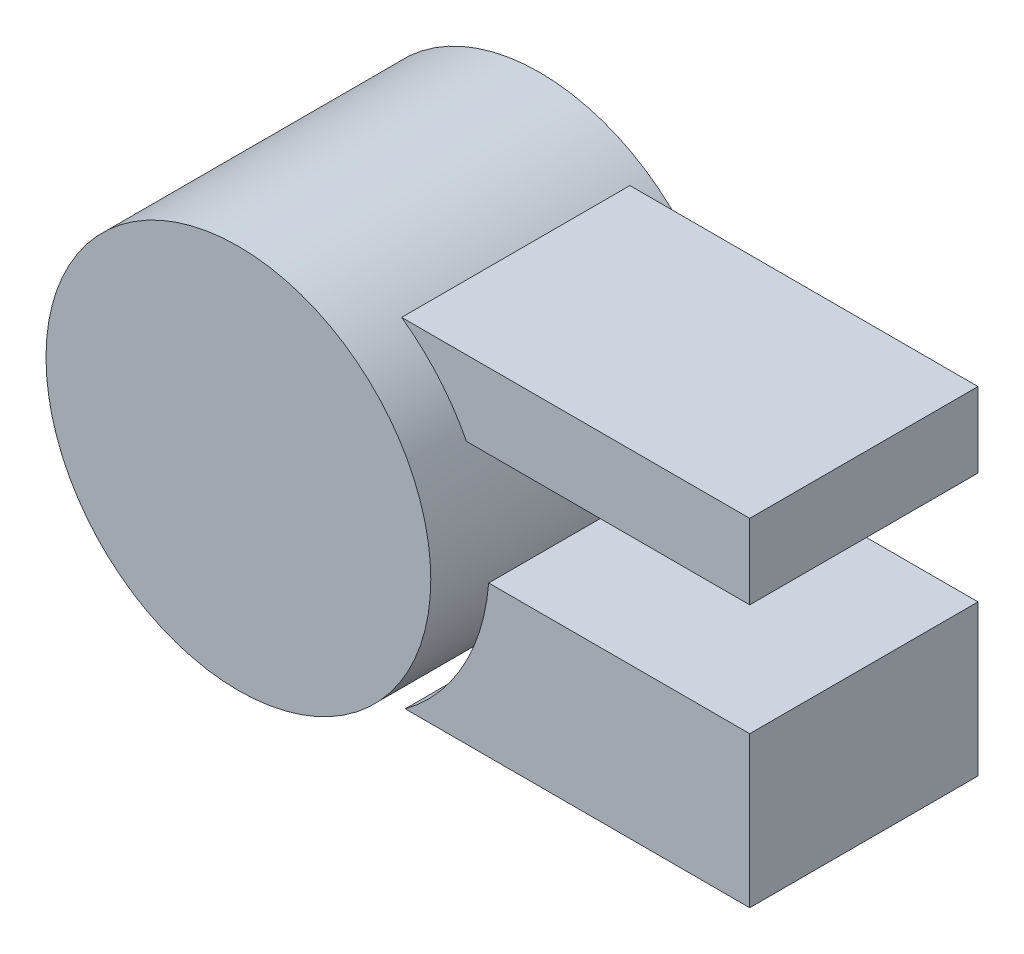
ISO-10303-21;
HEADER;
FILE_DESCRIPTION(('STEP AP214'),'2;1');
FILE_NAME('part.step','',(''),(''),'','','');
FILE_SCHEMA(('AUTOMOTIVE_DESIGN { 1 0 10303 214 1 1 1 1 }'));
ENDSEC;
DATA;
#1=APPLICATION_CONTEXT('core data for automotive mechanical design processes');
#2=APPLICATION_PROTOCOL_DEFINITION('international standard','automotive_design',2000,#1);
#3=PRODUCT_CONTEXT('',#1,'mechanical');
#4=PRODUCT('Part','Part','',(#3));
#5=PRODUCT_RELATED_PRODUCT_CATEGORY('part','',(#4));
#6=PRODUCT_DEFINITION_FORMATION('','',#4);
#7=PRODUCT_DEFINITION_CONTEXT('part definition',#1,'design');
#8=PRODUCT_DEFINITION('design','',#6,#7);
#9=PRODUCT_DEFINITION_SHAPE('','',#8);
#10=(LENGTH_UNIT() NAMED_UNIT(*) SI_UNIT(.MILLI.,.METRE.));
#11=(NAMED_UNIT(*) PLANE_ANGLE_UNIT() SI_UNIT($,.RADIAN.));
#12=(NAMED_UNIT(*) SI_UNIT($,.STERADIAN.) SOLID_ANGLE_UNIT());
#13=UNCERTAINTY_MEASURE_WITH_UNIT(LENGTH_MEASURE(1.E-05),#10,'distance_accuracy_value','');
#14=(GEOMETRIC_REPRESENTATION_CONTEXT(3) GLOBAL_UNCERTAINTY_ASSIGNED_CONTEXT((#13)) GLOBAL_UNIT_ASSIGNED_CONTEXT((#10,
#11,#12)) REPRESENTATION_CONTEXT('',''));
#15=CARTESIAN_POINT('',(0.,0.,0.));
#16=DIRECTION('',(0.,0.,1.));
#17=DIRECTION('',(1.,0.,0.));
#18=AXIS2_PLACEMENT_3D('',#15,#16,#17);
#19=CARTESIAN_POINT('',(185.42,0.,0.));
#20=DIRECTION('',(1.,0.,0.));
#21=DIRECTION('',(0.,0.,-1.));
#22=AXIS2_PLACEMENT_3D('',#19,#20,#21);
#23=PLANE('',#22);
#24=DIRECTION('',(0.,-1.,0.));
#25=VECTOR('',#24,1.);
#26=CARTESIAN_POINT('',(185.42,0.,42.7579039285186));
#27=LINE('',#26,#25);
#28=CARTESIAN_POINT('',(185.42,67.2031597601627,42.7579039285186));
#29=VERTEX_POINT('',#28);
#30=CARTESIAN_POINT('',(185.42,37.5622223754525,42.7579039285186));
#31=VERTEX_POINT('',#30);
#32=EDGE_CURVE('E101',#29,#31,#27,.T.);
#33=ORIENTED_EDGE('',*,*,#32,.T.);
#34=DIRECTION('',(0.,0.,-1.));
#35=VECTOR('',#34,1.);
#36=CARTESIAN_POINT('',(185.42,37.5622223754525,0.));
#37=LINE('',#36,#35);
#38=CARTESIAN_POINT('',(185.42,37.5622223754525,-47.527709944449));
#39=VERTEX_POINT('',#38);
#40=EDGE_CURVE('E117',#31,#39,#37,.T.);
#41=ORIENTED_EDGE('',*,*,#40,.T.);
#42=DIRECTION('',(0.,-1.,0.));
#43=VECTOR('',#42,1.);
#44=CARTESIAN_POINT('',(185.42,0.,-47.527709944449));
#45=LINE('',#44,#43);
#46=CARTESIAN_POINT('',(185.42,67.2031597601627,-47.527709944449));
#47=VERTEX_POINT('',#46);
#48=EDGE_CURVE('E105',#47,#39,#45,.T.);
#49=ORIENTED_EDGE('',*,*,#48,.F.);
#50=DIRECTION('',(0.,0.,-1.));
#51=VECTOR('',#50,1.);
#52=CARTESIAN_POINT('',(185.42,67.2031597601627,0.));
#53=LINE('',#52,#51);
#54=EDGE_CURVE('E96',#29,#47,#53,.T.);
#55=ORIENTED_EDGE('',*,*,#54,.F.);
#56=EDGE_LOOP('',(#33,#41,#49,#55));
#57=FACE_BOUND('',#56,.T.);
#58=ADVANCED_FACE('F51',(#57),#23,.T.);
#59=CARTESIAN_POINT('',(-88.791749690361,37.5622223754525,0.));
#60=DIRECTION('',(0.,-1.,0.));
#61=DIRECTION('',(0.,0.,-1.));
#62=AXIS2_PLACEMENT_3D('',#59,#60,#61);
#63=PLANE('',#62);
#64=DIRECTION('',(1.,0.,0.));
#65=VECTOR('',#64,1.);
#66=CARTESIAN_POINT('',(-88.791749690361,37.5622223754525,42.7579039285186));
#67=LINE('',#66,#65);
#68=CARTESIAN_POINT('',(73.3863519990319,37.5622223754525,42.7579039285186));
#69=VERTEX_POINT('',#68);
#70=EDGE_CURVE('E95',#69,#31,#67,.T.);
#71=ORIENTED_EDGE('',*,*,#70,.F.);
#72=DIRECTION('',(0.,0.,-1.));
#73=VECTOR('',#72,1.);
#74=CARTESIAN_POINT('',(73.3863519990319,37.5622223754525,59.563));
#75=LINE('',#74,#73);
#76=CARTESIAN_POINT('',(73.3863519990319,37.5622223754525,-47.527709944449));
#77=VERTEX_POINT('',#76);
#78=EDGE_CURVE('E67',#69,#77,#75,.T.);
#79=ORIENTED_EDGE('',*,*,#78,.T.);
#80=DIRECTION('',(1.,0.,0.));
#81=VECTOR('',#80,1.);
#82=CARTESIAN_POINT('',(-88.791749690361,37.5622223754525,-47.527709944449));
#83=LINE('',#82,#81);
#84=EDGE_CURVE('E55',#77,#39,#83,.T.);
#85=ORIENTED_EDGE('',*,*,#84,.T.);
#86=ORIENTED_EDGE('',*,*,#40,.F.);
#87=EDGE_LOOP('',(#71,#79,#85,#86));
#88=FACE_BOUND('',#87,.T.);
#89=ADVANCED_FACE('F126',(#88),#63,.T.);
#90=CARTESIAN_POINT('',(-88.791749690361,0.,-47.527709944449));
#91=DIRECTION('',(0.,0.,1.));
#92=DIRECTION('',(1.,0.,0.));
#93=AXIS2_PLACEMENT_3D('',#90,#91,#92);
#94=PLANE('',#93);
#95=CARTESIAN_POINT('',(0.,0.,-47.527709944449));
#96=DIRECTION('',(0.,0.,1.));
#97=DIRECTION('',(1.,0.,0.));
#98=AXIS2_PLACEMENT_3D('',#95,#96,#97);
#99=CIRCLE('',#98,82.4407496903611);
#100=CARTESIAN_POINT('',(47.7515709454549,67.2031597601627,-47.527709944449));
#101=VERTEX_POINT('',#100);
#102=EDGE_CURVE('E13',#101,#77,#99,.F.);
#103=ORIENTED_EDGE('',*,*,#102,.F.);
#104=DIRECTION('',(1.,0.,0.));
#105=VECTOR('',#104,1.);
#106=CARTESIAN_POINT('',(-88.791749690361,67.2031597601627,-47.527709944449));
#107=LINE('',#106,#105);
#108=EDGE_CURVE('E108',#101,#47,#107,.T.);
#109=ORIENTED_EDGE('',*,*,#108,.T.);
#110=ORIENTED_EDGE('',*,*,#48,.T.);
#111=ORIENTED_EDGE('',*,*,#84,.F.);
#112=EDGE_LOOP('',(#103,#109,#110,#111));
#113=FACE_BOUND('',#112,.T.);
#114=ADVANCED_FACE('F124',(#113),#94,.F.);
#115=CARTESIAN_POINT('',(-88.791749690361,67.2031597601627,0.));
#116=DIRECTION('',(0.,-1.,0.));
#117=DIRECTION('',(0.,0.,-1.));
#118=AXIS2_PLACEMENT_3D('',#115,#116,#117);
#119=PLANE('',#118);
#120=DIRECTION('',(0.,0.,-1.));
#121=VECTOR('',#120,1.);
#122=CARTESIAN_POINT('',(47.7515709454549,67.2031597601627,59.563));
#123=LINE('',#122,#121);
#124=CARTESIAN_POINT('',(47.7515709454549,67.2031597601627,42.7579039285186));
#125=VERTEX_POINT('',#124);
#126=EDGE_CURVE('E60',#125,#101,#123,.T.);
#127=ORIENTED_EDGE('',*,*,#126,.F.);
#128=DIRECTION('',(1.,0.,0.));
#129=VECTOR('',#128,1.);
#130=CARTESIAN_POINT('',(-88.791749690361,67.2031597601627,42.7579039285186));
#131=LINE('',#130,#129);
#132=EDGE_CURVE('E99',#125,#29,#131,.T.);
#133=ORIENTED_EDGE('',*,*,#132,.T.);
#134=ORIENTED_EDGE('',*,*,#54,.T.);
#135=ORIENTED_EDGE('',*,*,#108,.F.);
#136=EDGE_LOOP('',(#127,#133,#134,#135));
#137=FACE_BOUND('',#136,.T.);
#138=ADVANCED_FACE('F107',(#137),#119,.F.);
#139=CARTESIAN_POINT('',(-88.791749690361,0.,42.7579039285186));
#140=DIRECTION('',(0.,0.,1.));
#141=DIRECTION('',(1.,0.,0.));
#142=AXIS2_PLACEMENT_3D('',#139,#140,#141);
#143=PLANE('',#142);
#144=ORIENTED_EDGE('',*,*,#132,.F.);
#145=CARTESIAN_POINT('',(0.,0.,42.7579039285186));
#146=DIRECTION('',(0.,0.,1.));
#147=DIRECTION('',(1.,0.,0.));
#148=AXIS2_PLACEMENT_3D('',#145,#146,#147);
#149=CIRCLE('',#148,82.4407496903611);
#150=EDGE_CURVE('E88',#125,#69,#149,.F.);
#151=ORIENTED_EDGE('',*,*,#150,.T.);
#152=ORIENTED_EDGE('',*,*,#70,.T.);
#153=ORIENTED_EDGE('',*,*,#32,.F.);
#154=EDGE_LOOP('',(#144,#151,#152,#153));
#155=FACE_BOUND('',#154,.T.);
#156=ADVANCED_FACE('F53',(#155),#143,.T.);
#157=CARTESIAN_POINT('',(0.,0.,59.563));
#158=DIRECTION('',(0.,0.,-1.));
#159=DIRECTION('',(-1.,0.,0.));
#160=AXIS2_PLACEMENT_3D('',#157,#158,#159);
#161=CYLINDRICAL_SURFACE('',#160,82.4407496903611);
#162=ORIENTED_EDGE('',*,*,#150,.F.);
#163=ORIENTED_EDGE('',*,*,#126,.T.);
#164=ORIENTED_EDGE('',*,*,#102,.T.);
#165=ORIENTED_EDGE('',*,*,#78,.F.);
#166=EDGE_LOOP('',(#162,#163,#164,#165));
#167=FACE_BOUND('',#166,.T.);
#168=ADVANCED_FACE('F90',(#167),#161,.F.);
#169=CLOSED_SHELL('',(#58,#89,#114,#138,#156,#168));
#170=MANIFOLD_SOLID_BREP('B2',#169);
#171=CARTESIAN_POINT('',(0.,0.,59.563));
#172=DIRECTION('',(0.,0.,-1.));
#173=DIRECTION('',(-1.,0.,0.));
#174=AXIS2_PLACEMENT_3D('',#171,#172,#173);
#175=CYLINDRICAL_SURFACE('',#174,82.4407496903611);
#176=DIRECTION('',(0.,0.,-1.));
#177=VECTOR('',#176,1.);
#178=CARTESIAN_POINT('',(82.1794591530081,-6.55848327190335,59.563));
#179=LINE('',#178,#177);
#180=CARTESIAN_POINT('',(82.1794591530081,-6.55848327190335,42.7579039285186));
#181=VERTEX_POINT('',#180);
#182=CARTESIAN_POINT('',(82.1794591530081,-6.55848327190335,-47.527709944449));
#183=VERTEX_POINT('',#182);
#184=EDGE_CURVE('E199',#181,#183,#179,.T.);
#185=ORIENTED_EDGE('',*,*,#184,.T.);
#186=CARTESIAN_POINT('',(0.,0.,-47.527709944449));
#187=DIRECTION('',(0.,0.,1.));
#188=DIRECTION('',(1.,0.,0.));
#189=AXIS2_PLACEMENT_3D('',#186,#187,#188);
#190=CIRCLE('',#189,82.4407496903611);
#191=CARTESIAN_POINT('',(49.1583635728701,-66.181058471033,-47.527709944449));
#192=VERTEX_POINT('',#191);
#193=EDGE_CURVE('E249',#183,#192,#190,.F.);
#194=ORIENTED_EDGE('',*,*,#193,.T.);
#195=DIRECTION('',(0.,0.,-1.));
#196=VECTOR('',#195,1.);
#197=CARTESIAN_POINT('',(49.1583635728701,-66.181058471033,59.563));
#198=LINE('',#197,#196);
#199=CARTESIAN_POINT('',(49.1583635728701,-66.181058471033,42.7579039285186));
#200=VERTEX_POINT('',#199);
#201=EDGE_CURVE('E219',#200,#192,#198,.T.);
#202=ORIENTED_EDGE('',*,*,#201,.F.);
#203=CARTESIAN_POINT('',(0.,0.,42.7579039285186));
#204=DIRECTION('',(0.,0.,1.));
#205=DIRECTION('',(1.,0.,0.));
#206=AXIS2_PLACEMENT_3D('',#203,#204,#205);
#207=CIRCLE('',#206,82.4407496903611);
#208=EDGE_CURVE('E253',#181,#200,#207,.F.);
#209=ORIENTED_EDGE('',*,*,#208,.F.);
#210=EDGE_LOOP('',(#185,#194,#202,#209));
#211=FACE_BOUND('',#210,.T.);
#212=ADVANCED_FACE('F195',(#211),#175,.F.);
#213=CARTESIAN_POINT('',(185.42,0.,0.));
#214=DIRECTION('',(1.,0.,0.));
#215=DIRECTION('',(0.,0.,-1.));
#216=AXIS2_PLACEMENT_3D('',#213,#214,#215);
#217=PLANE('',#216);
#218=DIRECTION('',(0.,-1.,0.));
#219=VECTOR('',#218,1.);
#220=CARTESIAN_POINT('',(185.42,0.,-47.527709944449));
#221=LINE('',#220,#219);
#222=CARTESIAN_POINT('',(185.42,-6.55848327190335,-47.527709944449));
#223=VERTEX_POINT('',#222);
#224=CARTESIAN_POINT('',(185.42,-66.181058471033,-47.527709944449));
#225=VERTEX_POINT('',#224);
#226=EDGE_CURVE('E251',#223,#225,#221,.T.);
#227=ORIENTED_EDGE('',*,*,#226,.F.);
#228=DIRECTION('',(0.,0.,-1.));
#229=VECTOR('',#228,1.);
#230=CARTESIAN_POINT('',(185.42,-6.55848327190335,0.));
#231=LINE('',#230,#229);
#232=CARTESIAN_POINT('',(185.42,-6.55848327190335,42.7579039285186));
#233=VERTEX_POINT('',#232);
#234=EDGE_CURVE('E243',#233,#223,#231,.T.);
#235=ORIENTED_EDGE('',*,*,#234,.F.);
#236=DIRECTION('',(0.,-1.,0.));
#237=VECTOR('',#236,1.);
#238=CARTESIAN_POINT('',(185.42,0.,42.7579039285186));
#239=LINE('',#238,#237);
#240=CARTESIAN_POINT('',(185.42,-66.181058471033,42.7579039285186));
#241=VERTEX_POINT('',#240);
#242=EDGE_CURVE('E259',#233,#241,#239,.T.);
#243=ORIENTED_EDGE('',*,*,#242,.T.);
#244=DIRECTION('',(0.,0.,-1.));
#245=VECTOR('',#244,1.);
#246=CARTESIAN_POINT('',(185.42,-66.181058471033,0.));
#247=LINE('',#246,#245);
#248=EDGE_CURVE('E247',#241,#225,#247,.T.);
#249=ORIENTED_EDGE('',*,*,#248,.T.);
#250=EDGE_LOOP('',(#227,#235,#243,#249));
#251=FACE_BOUND('',#250,.T.);
#252=ADVANCED_FACE('F266',(#251),#217,.T.);
#253=CARTESIAN_POINT('',(-88.791749690361,-6.55848327190335,0.));
#254=DIRECTION('',(0.,-1.,0.));
#255=DIRECTION('',(0.,0.,-1.));
#256=AXIS2_PLACEMENT_3D('',#253,#254,#255);
#257=PLANE('',#256);
#258=ORIENTED_EDGE('',*,*,#184,.F.);
#259=DIRECTION('',(1.,0.,0.));
#260=VECTOR('',#259,1.);
#261=CARTESIAN_POINT('',(-88.791749690361,-6.55848327190335,42.7579039285186));
#262=LINE('',#261,#260);
#263=EDGE_CURVE('E212',#181,#233,#262,.T.);
#264=ORIENTED_EDGE('',*,*,#263,.T.);
#265=ORIENTED_EDGE('',*,*,#234,.T.);
#266=DIRECTION('',(1.,0.,0.));
#267=VECTOR('',#266,1.);
#268=CARTESIAN_POINT('',(-88.791749690361,-6.55848327190335,-47.527709944449));
#269=LINE('',#268,#267);
#270=EDGE_CURVE('E237',#183,#223,#269,.T.);
#271=ORIENTED_EDGE('',*,*,#270,.F.);
#272=EDGE_LOOP('',(#258,#264,#265,#271));
#273=FACE_BOUND('',#272,.T.);
#274=ADVANCED_FACE('F239',(#273),#257,.F.);
#275=CARTESIAN_POINT('',(-88.791749690361,0.,42.7579039285186));
#276=DIRECTION('',(0.,0.,1.));
#277=DIRECTION('',(1.,0.,0.));
#278=AXIS2_PLACEMENT_3D('',#275,#276,#277);
#279=PLANE('',#278);
#280=ORIENTED_EDGE('',*,*,#263,.F.);
#281=ORIENTED_EDGE('',*,*,#208,.T.);
#282=DIRECTION('',(1.,0.,0.));
#283=VECTOR('',#282,1.);
#284=CARTESIAN_POINT('',(-88.791749690361,-66.181058471033,42.7579039285186));
#285=LINE('',#284,#283);
#286=EDGE_CURVE('E204',#200,#241,#285,.T.);
#287=ORIENTED_EDGE('',*,*,#286,.T.);
#288=ORIENTED_EDGE('',*,*,#242,.F.);
#289=EDGE_LOOP('',(#280,#281,#287,#288));
#290=FACE_BOUND('',#289,.T.);
#291=ADVANCED_FACE('F268',(#290),#279,.T.);
#292=CARTESIAN_POINT('',(-88.791749690361,-66.181058471033,0.));
#293=DIRECTION('',(0.,-1.,0.));
#294=DIRECTION('',(0.,0.,-1.));
#295=AXIS2_PLACEMENT_3D('',#292,#293,#294);
#296=PLANE('',#295);
#297=ORIENTED_EDGE('',*,*,#286,.F.);
#298=ORIENTED_EDGE('',*,*,#201,.T.);
#299=DIRECTION('',(1.,0.,0.));
#300=VECTOR('',#299,1.);
#301=CARTESIAN_POINT('',(-88.791749690361,-66.181058471033,-47.527709944449));
#302=LINE('',#301,#300);
#303=EDGE_CURVE('E49',#192,#225,#302,.T.);
#304=ORIENTED_EDGE('',*,*,#303,.T.);
#305=ORIENTED_EDGE('',*,*,#248,.F.);
#306=EDGE_LOOP('',(#297,#298,#304,#305));
#307=FACE_BOUND('',#306,.T.);
#308=ADVANCED_FACE('F269',(#307),#296,.T.);
#309=CARTESIAN_POINT('',(-88.791749690361,0.,-47.527709944449));
#310=DIRECTION('',(0.,0.,1.));
#311=DIRECTION('',(1.,0.,0.));
#312=AXIS2_PLACEMENT_3D('',#309,#310,#311);
#313=PLANE('',#312);
#314=ORIENTED_EDGE('',*,*,#193,.F.);
#315=ORIENTED_EDGE('',*,*,#270,.T.);
#316=ORIENTED_EDGE('',*,*,#226,.T.);
#317=ORIENTED_EDGE('',*,*,#303,.F.);
#318=EDGE_LOOP('',(#314,#315,#316,#317));
#319=FACE_BOUND('',#318,.T.);
#320=ADVANCED_FACE('F197',(#319),#313,.F.);
#321=CLOSED_SHELL('',(#212,#252,#274,#291,#308,#320));
#322=MANIFOLD_SOLID_BREP('B7',#321);
#323=CARTESIAN_POINT('',(0.,0.,59.563));
#324=DIRECTION('',(0.,0.,-1.));
#325=DIRECTION('',(-1.,0.,0.));
#326=AXIS2_PLACEMENT_3D('',#323,#324,#325);
#327=CYLINDRICAL_SURFACE('',#326,76.0907496903611);
#328=CARTESIAN_POINT('',(0.,0.,59.563));
#329=DIRECTION('',(0.,0.,1.));
#330=DIRECTION('',(1.,0.,0.));
#331=AXIS2_PLACEMENT_3D('',#328,#329,#330);
#332=CIRCLE('',#331,76.0907496903611);
#333=CARTESIAN_POINT('',(76.0907496903611,0.,59.563));
#334=VERTEX_POINT('',#333);
#335=EDGE_CURVE('E194',#334,#334,#332,.T.);
#336=ORIENTED_EDGE('',*,*,#335,.F.);
#337=EDGE_LOOP('',(#336));
#338=FACE_BOUND('',#337,.T.);
#339=CARTESIAN_POINT('',(0.,0.,-59.563));
#340=DIRECTION('',(0.,0.,1.));
#341=DIRECTION('',(1.,0.,0.));
#342=AXIS2_PLACEMENT_3D('',#339,#340,#341);
#343=CIRCLE('',#342,76.0907496903611);
#344=CARTESIAN_POINT('',(76.0907496903611,0.,-59.563));
#345=VERTEX_POINT('',#344);
#346=EDGE_CURVE('E335',#345,#345,#343,.T.);
#347=ORIENTED_EDGE('',*,*,#346,.T.);
#348=EDGE_LOOP('',(#347));
#349=FACE_BOUND('',#348,.T.);
#350=ADVANCED_FACE('F332',(#338,#349),#327,.T.);
#351=CARTESIAN_POINT('',(0.,0.,59.563));
#352=DIRECTION('',(0.,0.,1.));
#353=DIRECTION('',(1.,0.,0.));
#354=AXIS2_PLACEMENT_3D('',#351,#352,#353);
#355=PLANE('',#354);
#356=ORIENTED_EDGE('',*,*,#335,.T.);
#357=EDGE_LOOP('',(#356));
#358=FACE_BOUND('',#357,.T.);
#359=ADVANCED_FACE('F347',(#358),#355,.T.);
#360=CARTESIAN_POINT('',(0.,0.,-59.563));
#361=DIRECTION('',(0.,0.,1.));
#362=DIRECTION('',(1.,0.,0.));
#363=AXIS2_PLACEMENT_3D('',#360,#361,#362);
#364=PLANE('',#363);
#365=ORIENTED_EDGE('',*,*,#346,.F.);
#366=EDGE_LOOP('',(#365));
#367=FACE_BOUND('',#366,.T.);
#368=ADVANCED_FACE('F345',(#367),#364,.F.);
#369=CLOSED_SHELL('',(#350,#359,#368));
#370=MANIFOLD_SOLID_BREP('B43',#369);
#371=ADVANCED_BREP_SHAPE_REPRESENTATION('',(#18,#170,#322,#370),#14);
#372=SHAPE_DEFINITION_REPRESENTATION(#9,#371);
ENDSEC;
END-ISO-10303-21;
